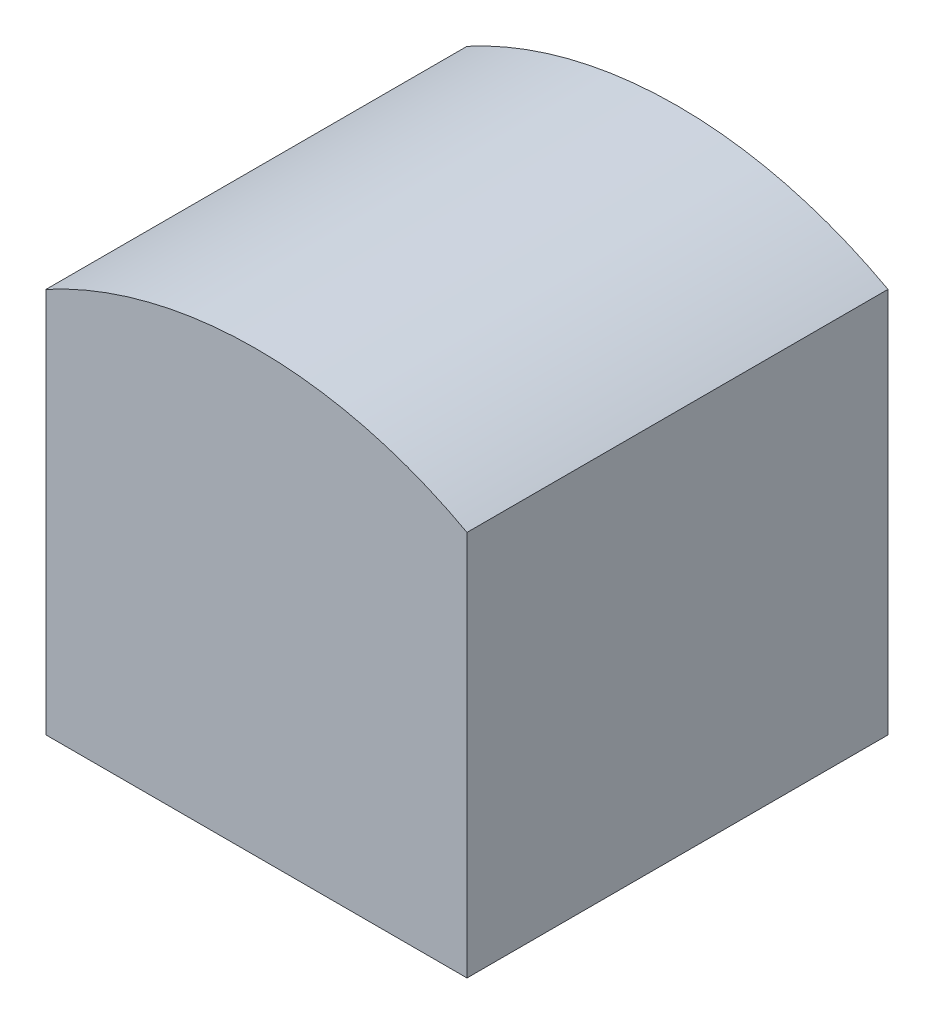
ISO-10303-21;
HEADER;
FILE_DESCRIPTION(('STEP AP214'),'2;1');
FILE_NAME('part.step','',(''),(''),'','','');
FILE_SCHEMA(('AUTOMOTIVE_DESIGN { 1 0 10303 214 1 1 1 1 }'));
ENDSEC;
DATA;
#1=APPLICATION_CONTEXT('core data for automotive mechanical design processes');
#2=APPLICATION_PROTOCOL_DEFINITION('international standard','automotive_design',2000,#1);
#3=PRODUCT_CONTEXT('',#1,'mechanical');
#4=PRODUCT('Part','Part','',(#3));
#5=PRODUCT_RELATED_PRODUCT_CATEGORY('part','',(#4));
#6=PRODUCT_DEFINITION_FORMATION('','',#4);
#7=PRODUCT_DEFINITION_CONTEXT('part definition',#1,'design');
#8=PRODUCT_DEFINITION('design','',#6,#7);
#9=PRODUCT_DEFINITION_SHAPE('','',#8);
#10=(LENGTH_UNIT() NAMED_UNIT(*) SI_UNIT(.MILLI.,.METRE.));
#11=(NAMED_UNIT(*) PLANE_ANGLE_UNIT() SI_UNIT($,.RADIAN.));
#12=(NAMED_UNIT(*) SI_UNIT($,.STERADIAN.) SOLID_ANGLE_UNIT());
#13=UNCERTAINTY_MEASURE_WITH_UNIT(LENGTH_MEASURE(1.E-05),#10,'distance_accuracy_value','');
#14=(GEOMETRIC_REPRESENTATION_CONTEXT(3) GLOBAL_UNCERTAINTY_ASSIGNED_CONTEXT((#13)) GLOBAL_UNIT_ASSIGNED_CONTEXT((#10,
#11,#12)) REPRESENTATION_CONTEXT('',''));
#15=CARTESIAN_POINT('',(0.,0.,0.));
#16=DIRECTION('',(0.,0.,1.));
#17=DIRECTION('',(1.,0.,0.));
#18=AXIS2_PLACEMENT_3D('',#15,#16,#17);
#19=CARTESIAN_POINT('',(60.,-55.,120.));
#20=DIRECTION('',(-1.,0.,0.));
#21=DIRECTION('',(0.,0.,1.));
#22=AXIS2_PLACEMENT_3D('',#19,#20,#21);
#23=PLANE('',#22);
#24=DIRECTION('',(0.,1.,0.));
#25=VECTOR('',#24,1.);
#26=CARTESIAN_POINT('',(60.,-55.,0.));
#27=LINE('',#26,#25);
#28=CARTESIAN_POINT('',(60.,-55.,0.));
#29=VERTEX_POINT('',#28);
#30=CARTESIAN_POINT('',(60.,55.,0.));
#31=VERTEX_POINT('',#30);
#32=EDGE_CURVE('E107',#29,#31,#27,.T.);
#33=ORIENTED_EDGE('',*,*,#32,.T.);
#34=DIRECTION('',(0.,0.,-1.));
#35=VECTOR('',#34,1.);
#36=CARTESIAN_POINT('',(60.,55.,120.));
#37=LINE('',#36,#35);
#38=CARTESIAN_POINT('',(60.,55.,120.));
#39=VERTEX_POINT('',#38);
#40=EDGE_CURVE('E11',#39,#31,#37,.T.);
#41=ORIENTED_EDGE('',*,*,#40,.F.);
#42=DIRECTION('',(0.,1.,0.));
#43=VECTOR('',#42,1.);
#44=CARTESIAN_POINT('',(60.,-55.,120.));
#45=LINE('',#44,#43);
#46=CARTESIAN_POINT('',(60.,-55.,120.));
#47=VERTEX_POINT('',#46);
#48=EDGE_CURVE('E91',#47,#39,#45,.T.);
#49=ORIENTED_EDGE('',*,*,#48,.F.);
#50=DIRECTION('',(0.,0.,-1.));
#51=VECTOR('',#50,1.);
#52=CARTESIAN_POINT('',(60.,-55.,120.));
#53=LINE('',#52,#51);
#54=EDGE_CURVE('E103',#47,#29,#53,.T.);
#55=ORIENTED_EDGE('',*,*,#54,.T.);
#56=EDGE_LOOP('',(#33,#41,#49,#55));
#57=FACE_BOUND('',#56,.T.);
#58=ADVANCED_FACE('F39',(#57),#23,.F.);
#59=CARTESIAN_POINT('',(0.,-55.,120.));
#60=DIRECTION('',(0.,0.,-1.));
#61=DIRECTION('',(-1.,0.,0.));
#62=AXIS2_PLACEMENT_3D('',#59,#60,#61);
#63=CYLINDRICAL_SURFACE('',#62,125.299640861417);
#64=CARTESIAN_POINT('',(0.,-55.,0.));
#65=DIRECTION('',(0.,0.,1.));
#66=DIRECTION('',(1.,0.,0.));
#67=AXIS2_PLACEMENT_3D('',#64,#65,#66);
#68=CIRCLE('',#67,125.299640861417);
#69=CARTESIAN_POINT('',(-60.,55.,0.));
#70=VERTEX_POINT('',#69);
#71=EDGE_CURVE('E96',#31,#70,#68,.T.);
#72=ORIENTED_EDGE('',*,*,#71,.T.);
#73=DIRECTION('',(0.,0.,-1.));
#74=VECTOR('',#73,1.);
#75=CARTESIAN_POINT('',(-60.,55.,120.));
#76=LINE('',#75,#74);
#77=CARTESIAN_POINT('',(-60.,55.,120.));
#78=VERTEX_POINT('',#77);
#79=EDGE_CURVE('E48',#78,#70,#76,.T.);
#80=ORIENTED_EDGE('',*,*,#79,.F.);
#81=CARTESIAN_POINT('',(0.,-55.,120.));
#82=DIRECTION('',(0.,0.,1.));
#83=DIRECTION('',(1.,0.,0.));
#84=AXIS2_PLACEMENT_3D('',#81,#82,#83);
#85=CIRCLE('',#84,125.299640861417);
#86=EDGE_CURVE('E86',#39,#78,#85,.T.);
#87=ORIENTED_EDGE('',*,*,#86,.F.);
#88=ORIENTED_EDGE('',*,*,#40,.T.);
#89=EDGE_LOOP('',(#72,#80,#87,#88));
#90=FACE_BOUND('',#89,.T.);
#91=ADVANCED_FACE('F95',(#90),#63,.T.);
#92=CARTESIAN_POINT('',(-60.,-55.,120.));
#93=DIRECTION('',(1.,0.,0.));
#94=DIRECTION('',(0.,0.,-1.));
#95=AXIS2_PLACEMENT_3D('',#92,#93,#94);
#96=PLANE('',#95);
#97=DIRECTION('',(0.,-1.,0.));
#98=VECTOR('',#97,1.);
#99=CARTESIAN_POINT('',(-60.,-55.,0.));
#100=LINE('',#99,#98);
#101=CARTESIAN_POINT('',(-60.,-55.,0.));
#102=VERTEX_POINT('',#101);
#103=EDGE_CURVE('E73',#70,#102,#100,.T.);
#104=ORIENTED_EDGE('',*,*,#103,.T.);
#105=DIRECTION('',(0.,0.,-1.));
#106=VECTOR('',#105,1.);
#107=CARTESIAN_POINT('',(-60.,-55.,120.));
#108=LINE('',#107,#106);
#109=CARTESIAN_POINT('',(-60.,-55.,120.));
#110=VERTEX_POINT('',#109);
#111=EDGE_CURVE('E98',#110,#102,#108,.T.);
#112=ORIENTED_EDGE('',*,*,#111,.F.);
#113=DIRECTION('',(0.,-1.,0.));
#114=VECTOR('',#113,1.);
#115=CARTESIAN_POINT('',(-60.,-55.,120.));
#116=LINE('',#115,#114);
#117=EDGE_CURVE('E89',#78,#110,#116,.T.);
#118=ORIENTED_EDGE('',*,*,#117,.F.);
#119=ORIENTED_EDGE('',*,*,#79,.T.);
#120=EDGE_LOOP('',(#104,#112,#118,#119));
#121=FACE_BOUND('',#120,.T.);
#122=ADVANCED_FACE('F99',(#121),#96,.F.);
#123=CARTESIAN_POINT('',(60.,-55.,120.));
#124=DIRECTION('',(0.,1.,0.));
#125=DIRECTION('',(-1.,0.,0.));
#126=AXIS2_PLACEMENT_3D('',#123,#124,#125);
#127=PLANE('',#126);
#128=DIRECTION('',(1.,0.,0.));
#129=VECTOR('',#128,1.);
#130=CARTESIAN_POINT('',(60.,-55.,0.));
#131=LINE('',#130,#129);
#132=EDGE_CURVE('E79',#102,#29,#131,.T.);
#133=ORIENTED_EDGE('',*,*,#132,.T.);
#134=ORIENTED_EDGE('',*,*,#54,.F.);
#135=DIRECTION('',(1.,0.,0.));
#136=VECTOR('',#135,1.);
#137=CARTESIAN_POINT('',(60.,-55.,120.));
#138=LINE('',#137,#136);
#139=EDGE_CURVE('E56',#110,#47,#138,.T.);
#140=ORIENTED_EDGE('',*,*,#139,.F.);
#141=ORIENTED_EDGE('',*,*,#111,.T.);
#142=EDGE_LOOP('',(#133,#134,#140,#141));
#143=FACE_BOUND('',#142,.T.);
#144=ADVANCED_FACE('F120',(#143),#127,.F.);
#145=CARTESIAN_POINT('',(0.,-55.,120.));
#146=DIRECTION('',(0.,0.,1.));
#147=DIRECTION('',(1.,0.,0.));
#148=AXIS2_PLACEMENT_3D('',#145,#146,#147);
#149=PLANE('',#148);
#150=ORIENTED_EDGE('',*,*,#48,.T.);
#151=ORIENTED_EDGE('',*,*,#86,.T.);
#152=ORIENTED_EDGE('',*,*,#117,.T.);
#153=ORIENTED_EDGE('',*,*,#139,.T.);
#154=EDGE_LOOP('',(#150,#151,#152,#153));
#155=FACE_BOUND('',#154,.T.);
#156=ADVANCED_FACE('F87',(#155),#149,.T.);
#157=CARTESIAN_POINT('',(0.,-55.,0.));
#158=DIRECTION('',(0.,0.,1.));
#159=DIRECTION('',(1.,0.,0.));
#160=AXIS2_PLACEMENT_3D('',#157,#158,#159);
#161=PLANE('',#160);
#162=ORIENTED_EDGE('',*,*,#32,.F.);
#163=ORIENTED_EDGE('',*,*,#132,.F.);
#164=ORIENTED_EDGE('',*,*,#103,.F.);
#165=ORIENTED_EDGE('',*,*,#71,.F.);
#166=EDGE_LOOP('',(#162,#163,#164,#165));
#167=FACE_BOUND('',#166,.T.);
#168=ADVANCED_FACE('F123',(#167),#161,.F.);
#169=CLOSED_SHELL('',(#58,#91,#122,#144,#156,#168));
#170=MANIFOLD_SOLID_BREP('B2',#169);
#171=ADVANCED_BREP_SHAPE_REPRESENTATION('',(#18,#170),#14);
#172=SHAPE_DEFINITION_REPRESENTATION(#9,#171);
ENDSEC;
END-ISO-10303-21;
